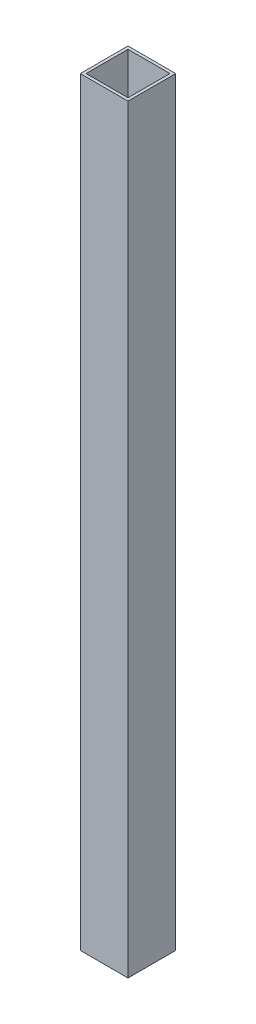
ISO-10303-21;
HEADER;
FILE_DESCRIPTION(('STEP AP214'),'2;1');
FILE_NAME('part.step','',(''),(''),'','','');
FILE_SCHEMA(('AUTOMOTIVE_DESIGN { 1 0 10303 214 1 1 1 1 }'));
ENDSEC;
DATA;
#1=APPLICATION_CONTEXT('core data for automotive mechanical design processes');
#2=APPLICATION_PROTOCOL_DEFINITION('international standard','automotive_design',2000,#1);
#3=PRODUCT_CONTEXT('',#1,'mechanical');
#4=PRODUCT('Part','Part','',(#3));
#5=PRODUCT_RELATED_PRODUCT_CATEGORY('part','',(#4));
#6=PRODUCT_DEFINITION_FORMATION('','',#4);
#7=PRODUCT_DEFINITION_CONTEXT('part definition',#1,'design');
#8=PRODUCT_DEFINITION('design','',#6,#7);
#9=PRODUCT_DEFINITION_SHAPE('','',#8);
#10=(LENGTH_UNIT() NAMED_UNIT(*) SI_UNIT(.MILLI.,.METRE.));
#11=(NAMED_UNIT(*) PLANE_ANGLE_UNIT() SI_UNIT($,.RADIAN.));
#12=(NAMED_UNIT(*) SI_UNIT($,.STERADIAN.) SOLID_ANGLE_UNIT());
#13=UNCERTAINTY_MEASURE_WITH_UNIT(LENGTH_MEASURE(1.E-05),#10,'distance_accuracy_value','');
#14=(GEOMETRIC_REPRESENTATION_CONTEXT(3) GLOBAL_UNCERTAINTY_ASSIGNED_CONTEXT((#13)) GLOBAL_UNIT_ASSIGNED_CONTEXT((#10,
#11,#12)) REPRESENTATION_CONTEXT('',''));
#15=CARTESIAN_POINT('',(0.,0.,0.));
#16=DIRECTION('',(0.,0.,1.));
#17=DIRECTION('',(1.,0.,0.));
#18=AXIS2_PLACEMENT_3D('',#15,#16,#17);
#19=CARTESIAN_POINT('',(0.,199.,0.));
#20=DIRECTION('',(0.,1.,0.));
#21=DIRECTION('',(0.,0.,1.));
#22=AXIS2_PLACEMENT_3D('',#19,#20,#21);
#23=PLANE('',#22);
#24=DIRECTION('',(0.,0.,-1.));
#25=VECTOR('',#24,1.);
#26=CARTESIAN_POINT('',(12.5,199.,12.5));
#27=LINE('',#26,#25);
#28=CARTESIAN_POINT('',(12.5,199.,12.5));
#29=VERTEX_POINT('',#28);
#30=CARTESIAN_POINT('',(12.5,199.,-12.5));
#31=VERTEX_POINT('',#30);
#32=EDGE_CURVE('E158',#29,#31,#27,.T.);
#33=ORIENTED_EDGE('',*,*,#32,.T.);
#34=DIRECTION('',(-1.,0.,0.));
#35=VECTOR('',#34,1.);
#36=CARTESIAN_POINT('',(-12.5,199.,-12.5));
#37=LINE('',#36,#35);
#38=CARTESIAN_POINT('',(-12.5,199.,-12.5));
#39=VERTEX_POINT('',#38);
#40=EDGE_CURVE('E161',#31,#39,#37,.T.);
#41=ORIENTED_EDGE('',*,*,#40,.T.);
#42=DIRECTION('',(0.,0.,1.));
#43=VECTOR('',#42,1.);
#44=CARTESIAN_POINT('',(-12.5,199.,12.5));
#45=LINE('',#44,#43);
#46=CARTESIAN_POINT('',(-12.5,199.,12.5));
#47=VERTEX_POINT('',#46);
#48=EDGE_CURVE('E164',#39,#47,#45,.T.);
#49=ORIENTED_EDGE('',*,*,#48,.T.);
#50=DIRECTION('',(1.,0.,0.));
#51=VECTOR('',#50,1.);
#52=CARTESIAN_POINT('',(-12.5,199.,12.5));
#53=LINE('',#52,#51);
#54=EDGE_CURVE('E166',#47,#29,#53,.T.);
#55=ORIENTED_EDGE('',*,*,#54,.T.);
#56=EDGE_LOOP('',(#33,#41,#49,#55));
#57=FACE_BOUND('',#56,.T.);
#58=DIRECTION('',(-1.,0.,0.));
#59=VECTOR('',#58,1.);
#60=CARTESIAN_POINT('',(0.,199.,-11.));
#61=LINE('',#60,#59);
#62=CARTESIAN_POINT('',(11.,199.,-11.));
#63=VERTEX_POINT('',#62);
#64=CARTESIAN_POINT('',(-11.,199.,-11.));
#65=VERTEX_POINT('',#64);
#66=EDGE_CURVE('E130',#63,#65,#61,.T.);
#67=ORIENTED_EDGE('',*,*,#66,.F.);
#68=DIRECTION('',(0.,0.,-1.));
#69=VECTOR('',#68,1.);
#70=CARTESIAN_POINT('',(11.,199.,0.));
#71=LINE('',#70,#69);
#72=CARTESIAN_POINT('',(11.,199.,11.));
#73=VERTEX_POINT('',#72);
#74=EDGE_CURVE('E122',#73,#63,#71,.T.);
#75=ORIENTED_EDGE('',*,*,#74,.F.);
#76=DIRECTION('',(1.,0.,0.));
#77=VECTOR('',#76,1.);
#78=CARTESIAN_POINT('',(0.,199.,11.));
#79=LINE('',#78,#77);
#80=CARTESIAN_POINT('',(-11.,199.,11.));
#81=VERTEX_POINT('',#80);
#82=EDGE_CURVE('E144',#81,#73,#79,.T.);
#83=ORIENTED_EDGE('',*,*,#82,.F.);
#84=DIRECTION('',(0.,0.,1.));
#85=VECTOR('',#84,1.);
#86=CARTESIAN_POINT('',(-11.,199.,0.));
#87=LINE('',#86,#85);
#88=EDGE_CURVE('E142',#65,#81,#87,.T.);
#89=ORIENTED_EDGE('',*,*,#88,.F.);
#90=EDGE_LOOP('',(#67,#75,#83,#89));
#91=FACE_BOUND('',#90,.T.);
#92=ADVANCED_FACE('F57',(#57,#91),#23,.T.);
#93=CARTESIAN_POINT('',(0.,-199.,0.));
#94=DIRECTION('',(0.,1.,0.));
#95=DIRECTION('',(0.,0.,1.));
#96=AXIS2_PLACEMENT_3D('',#93,#94,#95);
#97=PLANE('',#96);
#98=DIRECTION('',(0.,0.,-1.));
#99=VECTOR('',#98,1.);
#100=CARTESIAN_POINT('',(12.5,-199.,12.5));
#101=LINE('',#100,#99);
#102=CARTESIAN_POINT('',(12.5,-199.,12.5));
#103=VERTEX_POINT('',#102);
#104=CARTESIAN_POINT('',(12.5,-199.,-12.5));
#105=VERTEX_POINT('',#104);
#106=EDGE_CURVE('E138',#103,#105,#101,.T.);
#107=ORIENTED_EDGE('',*,*,#106,.F.);
#108=DIRECTION('',(1.,0.,0.));
#109=VECTOR('',#108,1.);
#110=CARTESIAN_POINT('',(-12.5,-199.,12.5));
#111=LINE('',#110,#109);
#112=CARTESIAN_POINT('',(-12.5,-199.,12.5));
#113=VERTEX_POINT('',#112);
#114=EDGE_CURVE('E162',#113,#103,#111,.T.);
#115=ORIENTED_EDGE('',*,*,#114,.F.);
#116=DIRECTION('',(0.,0.,1.));
#117=VECTOR('',#116,1.);
#118=CARTESIAN_POINT('',(-12.5,-199.,12.5));
#119=LINE('',#118,#117);
#120=CARTESIAN_POINT('',(-12.5,-199.,-12.5));
#121=VERTEX_POINT('',#120);
#122=EDGE_CURVE('E173',#121,#113,#119,.T.);
#123=ORIENTED_EDGE('',*,*,#122,.F.);
#124=DIRECTION('',(-1.,0.,0.));
#125=VECTOR('',#124,1.);
#126=CARTESIAN_POINT('',(-12.5,-199.,-12.5));
#127=LINE('',#126,#125);
#128=EDGE_CURVE('E171',#105,#121,#127,.T.);
#129=ORIENTED_EDGE('',*,*,#128,.F.);
#130=EDGE_LOOP('',(#107,#115,#123,#129));
#131=FACE_BOUND('',#130,.T.);
#132=DIRECTION('',(0.,0.,-1.));
#133=VECTOR('',#132,1.);
#134=CARTESIAN_POINT('',(11.,-199.,0.));
#135=LINE('',#134,#133);
#136=CARTESIAN_POINT('',(11.,-199.,11.));
#137=VERTEX_POINT('',#136);
#138=CARTESIAN_POINT('',(11.,-199.,-11.));
#139=VERTEX_POINT('',#138);
#140=EDGE_CURVE('E80',#137,#139,#135,.T.);
#141=ORIENTED_EDGE('',*,*,#140,.T.);
#142=DIRECTION('',(-1.,0.,0.));
#143=VECTOR('',#142,1.);
#144=CARTESIAN_POINT('',(0.,-199.,-11.));
#145=LINE('',#144,#143);
#146=CARTESIAN_POINT('',(-11.,-199.,-11.));
#147=VERTEX_POINT('',#146);
#148=EDGE_CURVE('E137',#139,#147,#145,.T.);
#149=ORIENTED_EDGE('',*,*,#148,.T.);
#150=DIRECTION('',(0.,0.,1.));
#151=VECTOR('',#150,1.);
#152=CARTESIAN_POINT('',(-11.,-199.,0.));
#153=LINE('',#152,#151);
#154=CARTESIAN_POINT('',(-11.,-199.,11.));
#155=VERTEX_POINT('',#154);
#156=EDGE_CURVE('E150',#147,#155,#153,.T.);
#157=ORIENTED_EDGE('',*,*,#156,.T.);
#158=DIRECTION('',(1.,0.,0.));
#159=VECTOR('',#158,1.);
#160=CARTESIAN_POINT('',(0.,-199.,11.));
#161=LINE('',#160,#159);
#162=EDGE_CURVE('E131',#155,#137,#161,.T.);
#163=ORIENTED_EDGE('',*,*,#162,.T.);
#164=EDGE_LOOP('',(#141,#149,#157,#163));
#165=FACE_BOUND('',#164,.T.);
#166=ADVANCED_FACE('F191',(#131,#165),#97,.F.);
#167=CARTESIAN_POINT('',(12.5,199.,12.5));
#168=DIRECTION('',(-1.,0.,0.));
#169=DIRECTION('',(0.,0.,1.));
#170=AXIS2_PLACEMENT_3D('',#167,#168,#169);
#171=PLANE('',#170);
#172=ORIENTED_EDGE('',*,*,#106,.T.);
#173=DIRECTION('',(0.,-1.,0.));
#174=VECTOR('',#173,1.);
#175=CARTESIAN_POINT('',(12.5,199.,-12.5));
#176=LINE('',#175,#174);
#177=EDGE_CURVE('E12',#31,#105,#176,.T.);
#178=ORIENTED_EDGE('',*,*,#177,.F.);
#179=ORIENTED_EDGE('',*,*,#32,.F.);
#180=DIRECTION('',(0.,-1.,0.));
#181=VECTOR('',#180,1.);
#182=CARTESIAN_POINT('',(12.5,199.,12.5));
#183=LINE('',#182,#181);
#184=EDGE_CURVE('E168',#29,#103,#183,.T.);
#185=ORIENTED_EDGE('',*,*,#184,.T.);
#186=EDGE_LOOP('',(#172,#178,#179,#185));
#187=FACE_BOUND('',#186,.T.);
#188=ADVANCED_FACE('F59',(#187),#171,.F.);
#189=CARTESIAN_POINT('',(-12.5,199.,-12.5));
#190=DIRECTION('',(0.,0.,1.));
#191=DIRECTION('',(1.,0.,0.));
#192=AXIS2_PLACEMENT_3D('',#189,#190,#191);
#193=PLANE('',#192);
#194=ORIENTED_EDGE('',*,*,#128,.T.);
#195=DIRECTION('',(0.,-1.,0.));
#196=VECTOR('',#195,1.);
#197=CARTESIAN_POINT('',(-12.5,199.,-12.5));
#198=LINE('',#197,#196);
#199=EDGE_CURVE('E65',#39,#121,#198,.T.);
#200=ORIENTED_EDGE('',*,*,#199,.F.);
#201=ORIENTED_EDGE('',*,*,#40,.F.);
#202=ORIENTED_EDGE('',*,*,#177,.T.);
#203=EDGE_LOOP('',(#194,#200,#201,#202));
#204=FACE_BOUND('',#203,.T.);
#205=ADVANCED_FACE('F201',(#204),#193,.F.);
#206=CARTESIAN_POINT('',(-12.5,199.,12.5));
#207=DIRECTION('',(1.,0.,0.));
#208=DIRECTION('',(0.,0.,-1.));
#209=AXIS2_PLACEMENT_3D('',#206,#207,#208);
#210=PLANE('',#209);
#211=ORIENTED_EDGE('',*,*,#122,.T.);
#212=DIRECTION('',(0.,-1.,0.));
#213=VECTOR('',#212,1.);
#214=CARTESIAN_POINT('',(-12.5,199.,12.5));
#215=LINE('',#214,#213);
#216=EDGE_CURVE('E178',#47,#113,#215,.T.);
#217=ORIENTED_EDGE('',*,*,#216,.F.);
#218=ORIENTED_EDGE('',*,*,#48,.F.);
#219=ORIENTED_EDGE('',*,*,#199,.T.);
#220=EDGE_LOOP('',(#211,#217,#218,#219));
#221=FACE_BOUND('',#220,.T.);
#222=ADVANCED_FACE('F185',(#221),#210,.F.);
#223=CARTESIAN_POINT('',(-12.5,199.,12.5));
#224=DIRECTION('',(0.,0.,-1.));
#225=DIRECTION('',(-1.,0.,0.));
#226=AXIS2_PLACEMENT_3D('',#223,#224,#225);
#227=PLANE('',#226);
#228=ORIENTED_EDGE('',*,*,#114,.T.);
#229=ORIENTED_EDGE('',*,*,#184,.F.);
#230=ORIENTED_EDGE('',*,*,#54,.F.);
#231=ORIENTED_EDGE('',*,*,#216,.T.);
#232=EDGE_LOOP('',(#228,#229,#230,#231));
#233=FACE_BOUND('',#232,.T.);
#234=ADVANCED_FACE('F195',(#233),#227,.F.);
#235=CARTESIAN_POINT('',(11.,199.,0.));
#236=DIRECTION('',(-1.,0.,0.));
#237=DIRECTION('',(0.,0.,1.));
#238=AXIS2_PLACEMENT_3D('',#235,#236,#237);
#239=PLANE('',#238);
#240=ORIENTED_EDGE('',*,*,#140,.F.);
#241=DIRECTION('',(0.,-1.,0.));
#242=VECTOR('',#241,1.);
#243=CARTESIAN_POINT('',(11.,199.,11.));
#244=LINE('',#243,#242);
#245=EDGE_CURVE('E126',#73,#137,#244,.T.);
#246=ORIENTED_EDGE('',*,*,#245,.F.);
#247=ORIENTED_EDGE('',*,*,#74,.T.);
#248=DIRECTION('',(0.,-1.,0.));
#249=VECTOR('',#248,1.);
#250=CARTESIAN_POINT('',(11.,199.,-11.));
#251=LINE('',#250,#249);
#252=EDGE_CURVE('E125',#63,#139,#251,.T.);
#253=ORIENTED_EDGE('',*,*,#252,.T.);
#254=EDGE_LOOP('',(#240,#246,#247,#253));
#255=FACE_BOUND('',#254,.T.);
#256=ADVANCED_FACE('F124',(#255),#239,.T.);
#257=CARTESIAN_POINT('',(0.,199.,-11.));
#258=DIRECTION('',(0.,0.,1.));
#259=DIRECTION('',(1.,0.,0.));
#260=AXIS2_PLACEMENT_3D('',#257,#258,#259);
#261=PLANE('',#260);
#262=ORIENTED_EDGE('',*,*,#148,.F.);
#263=ORIENTED_EDGE('',*,*,#252,.F.);
#264=ORIENTED_EDGE('',*,*,#66,.T.);
#265=DIRECTION('',(0.,-1.,0.));
#266=VECTOR('',#265,1.);
#267=CARTESIAN_POINT('',(-11.,199.,-11.));
#268=LINE('',#267,#266);
#269=EDGE_CURVE('E139',#65,#147,#268,.T.);
#270=ORIENTED_EDGE('',*,*,#269,.T.);
#271=EDGE_LOOP('',(#262,#263,#264,#270));
#272=FACE_BOUND('',#271,.T.);
#273=ADVANCED_FACE('F134',(#272),#261,.T.);
#274=CARTESIAN_POINT('',(-11.,199.,0.));
#275=DIRECTION('',(1.,0.,0.));
#276=DIRECTION('',(0.,0.,-1.));
#277=AXIS2_PLACEMENT_3D('',#274,#275,#276);
#278=PLANE('',#277);
#279=ORIENTED_EDGE('',*,*,#156,.F.);
#280=ORIENTED_EDGE('',*,*,#269,.F.);
#281=ORIENTED_EDGE('',*,*,#88,.T.);
#282=DIRECTION('',(0.,-1.,0.));
#283=VECTOR('',#282,1.);
#284=CARTESIAN_POINT('',(-11.,199.,11.));
#285=LINE('',#284,#283);
#286=EDGE_CURVE('E72',#81,#155,#285,.T.);
#287=ORIENTED_EDGE('',*,*,#286,.T.);
#288=EDGE_LOOP('',(#279,#280,#281,#287));
#289=FACE_BOUND('',#288,.T.);
#290=ADVANCED_FACE('F224',(#289),#278,.T.);
#291=CARTESIAN_POINT('',(0.,199.,11.));
#292=DIRECTION('',(0.,0.,-1.));
#293=DIRECTION('',(-1.,0.,0.));
#294=AXIS2_PLACEMENT_3D('',#291,#292,#293);
#295=PLANE('',#294);
#296=ORIENTED_EDGE('',*,*,#162,.F.);
#297=ORIENTED_EDGE('',*,*,#286,.F.);
#298=ORIENTED_EDGE('',*,*,#82,.T.);
#299=ORIENTED_EDGE('',*,*,#245,.T.);
#300=EDGE_LOOP('',(#296,#297,#298,#299));
#301=FACE_BOUND('',#300,.T.);
#302=ADVANCED_FACE('F228',(#301),#295,.T.);
#303=CLOSED_SHELL('',(#92,#166,#188,#205,#222,#234,#256,#273,#290,#302));
#304=MANIFOLD_SOLID_BREP('B2',#303);
#305=ADVANCED_BREP_SHAPE_REPRESENTATION('',(#18,#304),#14);
#306=SHAPE_DEFINITION_REPRESENTATION(#9,#305);
ENDSEC;
END-ISO-10303-21;
